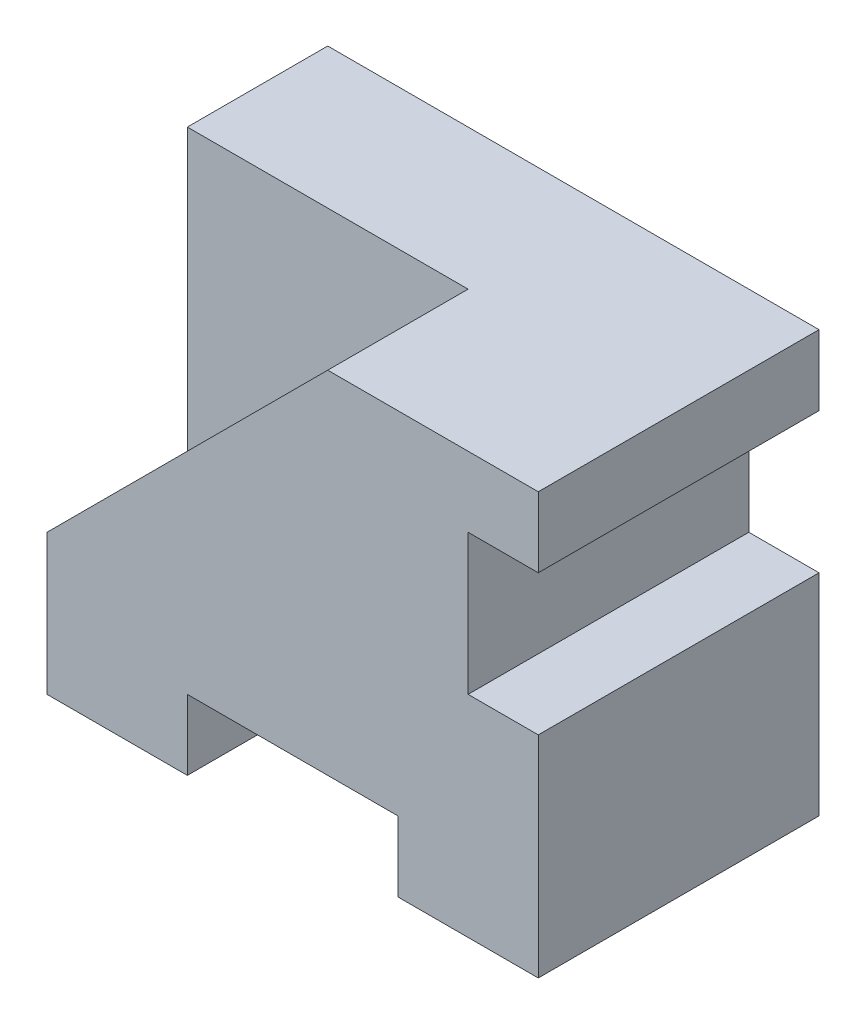
ISO-10303-21;
HEADER;
FILE_DESCRIPTION(('STEP AP214'),'2;1');
FILE_NAME('part.step','',(''),(''),'','','');
FILE_SCHEMA(('AUTOMOTIVE_DESIGN { 1 0 10303 214 1 1 1 1 }'));
ENDSEC;
DATA;
#1=APPLICATION_CONTEXT('core data for automotive mechanical design processes');
#2=APPLICATION_PROTOCOL_DEFINITION('international standard','automotive_design',2000,#1);
#3=PRODUCT_CONTEXT('',#1,'mechanical');
#4=PRODUCT('Part','Part','',(#3));
#5=PRODUCT_RELATED_PRODUCT_CATEGORY('part','',(#4));
#6=PRODUCT_DEFINITION_FORMATION('','',#4);
#7=PRODUCT_DEFINITION_CONTEXT('part definition',#1,'design');
#8=PRODUCT_DEFINITION('design','',#6,#7);
#9=PRODUCT_DEFINITION_SHAPE('','',#8);
#10=(LENGTH_UNIT() NAMED_UNIT(*) SI_UNIT(.MILLI.,.METRE.));
#11=(NAMED_UNIT(*) PLANE_ANGLE_UNIT() SI_UNIT($,.RADIAN.));
#12=(NAMED_UNIT(*) SI_UNIT($,.STERADIAN.) SOLID_ANGLE_UNIT());
#13=UNCERTAINTY_MEASURE_WITH_UNIT(LENGTH_MEASURE(1.E-05),#10,'distance_accuracy_value','');
#14=(GEOMETRIC_REPRESENTATION_CONTEXT(3) GLOBAL_UNCERTAINTY_ASSIGNED_CONTEXT((#13)) GLOBAL_UNIT_ASSIGNED_CONTEXT((#10,
#11,#12)) REPRESENTATION_CONTEXT('',''));
#15=CARTESIAN_POINT('',(0.,0.,0.));
#16=DIRECTION('',(0.,0.,1.));
#17=DIRECTION('',(1.,0.,0.));
#18=AXIS2_PLACEMENT_3D('',#15,#16,#17);
#19=CARTESIAN_POINT('',(0.,60.,0.));
#20=DIRECTION('',(0.,-1.,0.));
#21=DIRECTION('',(0.,0.,-1.));
#22=AXIS2_PLACEMENT_3D('',#19,#20,#21);
#23=PLANE('',#22);
#24=DIRECTION('',(0.,0.,-1.));
#25=VECTOR('',#24,1.);
#26=CARTESIAN_POINT('',(5.00000000000001,60.0000000000001,195.623445264011));
#27=LINE('',#26,#25);
#28=CARTESIAN_POINT('',(5.00000000000001,60.0000000000001,20.0000000000001));
#29=VERTEX_POINT('',#28);
#30=CARTESIAN_POINT('',(4.99999999999994,60.0000000000001,0.));
#31=VERTEX_POINT('',#30);
#32=EDGE_CURVE('E52',#29,#31,#27,.T.);
#33=ORIENTED_EDGE('',*,*,#32,.F.);
#34=DIRECTION('',(1.,0.,0.));
#35=VECTOR('',#34,1.);
#36=CARTESIAN_POINT('',(-35.,60.,20.));
#37=LINE('',#36,#35);
#38=CARTESIAN_POINT('',(35.,60.,20.));
#39=VERTEX_POINT('',#38);
#40=EDGE_CURVE('E155',#29,#39,#37,.T.);
#41=ORIENTED_EDGE('',*,*,#40,.T.);
#42=DIRECTION('',(0.,0.,-1.));
#43=VECTOR('',#42,1.);
#44=CARTESIAN_POINT('',(35.,60.,20.));
#45=LINE('',#44,#43);
#46=CARTESIAN_POINT('',(35.,60.,-20.));
#47=VERTEX_POINT('',#46);
#48=EDGE_CURVE('E172',#39,#47,#45,.T.);
#49=ORIENTED_EDGE('',*,*,#48,.T.);
#50=DIRECTION('',(-1.,0.,0.));
#51=VECTOR('',#50,1.);
#52=CARTESIAN_POINT('',(-35.,60.,-20.));
#53=LINE('',#52,#51);
#54=CARTESIAN_POINT('',(-35.,60.,-20.));
#55=VERTEX_POINT('',#54);
#56=EDGE_CURVE('E187',#47,#55,#53,.T.);
#57=ORIENTED_EDGE('',*,*,#56,.T.);
#58=DIRECTION('',(0.,0.,1.));
#59=VECTOR('',#58,1.);
#60=CARTESIAN_POINT('',(-35.,60.,20.));
#61=LINE('',#60,#59);
#62=CARTESIAN_POINT('',(-35.,60.,0.));
#63=VERTEX_POINT('',#62);
#64=EDGE_CURVE('E184',#55,#63,#61,.T.);
#65=ORIENTED_EDGE('',*,*,#64,.T.);
#66=DIRECTION('',(1.,0.,0.));
#67=VECTOR('',#66,1.);
#68=CARTESIAN_POINT('',(-35.,60.,0.));
#69=LINE('',#68,#67);
#70=EDGE_CURVE('E240',#63,#31,#69,.T.);
#71=ORIENTED_EDGE('',*,*,#70,.T.);
#72=EDGE_LOOP('',(#33,#41,#49,#57,#65,#71));
#73=FACE_BOUND('',#72,.T.);
#74=ADVANCED_FACE('F37',(#73),#23,.F.);
#75=CARTESIAN_POINT('',(35.,60.,20.));
#76=DIRECTION('',(-1.,0.,0.));
#77=DIRECTION('',(0.,0.,1.));
#78=AXIS2_PLACEMENT_3D('',#75,#76,#77);
#79=PLANE('',#78);
#80=DIRECTION('',(0.,-1.,0.));
#81=VECTOR('',#80,1.);
#82=CARTESIAN_POINT('',(35.,60.,-20.));
#83=LINE('',#82,#81);
#84=CARTESIAN_POINT('',(35.,30.,-20.));
#85=VERTEX_POINT('',#84);
#86=CARTESIAN_POINT('',(35.,0.,-20.));
#87=VERTEX_POINT('',#86);
#88=EDGE_CURVE('E45',#85,#87,#83,.T.);
#89=ORIENTED_EDGE('',*,*,#88,.F.);
#90=DIRECTION('',(0.,0.,1.));
#91=VECTOR('',#90,1.);
#92=CARTESIAN_POINT('',(35.,30.,-20.));
#93=LINE('',#92,#91);
#94=CARTESIAN_POINT('',(35.,30.,20.));
#95=VERTEX_POINT('',#94);
#96=EDGE_CURVE('E209',#85,#95,#93,.T.);
#97=ORIENTED_EDGE('',*,*,#96,.T.);
#98=DIRECTION('',(0.,-1.,0.));
#99=VECTOR('',#98,1.);
#100=CARTESIAN_POINT('',(35.,60.,20.));
#101=LINE('',#100,#99);
#102=CARTESIAN_POINT('',(35.,0.,20.));
#103=VERTEX_POINT('',#102);
#104=EDGE_CURVE('E167',#95,#103,#101,.T.);
#105=ORIENTED_EDGE('',*,*,#104,.T.);
#106=DIRECTION('',(0.,0.,-1.));
#107=VECTOR('',#106,1.);
#108=CARTESIAN_POINT('',(35.,0.,20.));
#109=LINE('',#108,#107);
#110=EDGE_CURVE('E179',#103,#87,#109,.T.);
#111=ORIENTED_EDGE('',*,*,#110,.T.);
#112=EDGE_LOOP('',(#89,#97,#105,#111));
#113=FACE_BOUND('',#112,.T.);
#114=ADVANCED_FACE('F274',(#113),#79,.F.);
#115=CARTESIAN_POINT('',(0.,0.,0.));
#116=DIRECTION('',(0.,-1.,0.));
#117=DIRECTION('',(0.,0.,-1.));
#118=AXIS2_PLACEMENT_3D('',#115,#116,#117);
#119=PLANE('',#118);
#120=DIRECTION('',(0.,0.,1.));
#121=VECTOR('',#120,1.);
#122=CARTESIAN_POINT('',(-15.,0.,-20.));
#123=LINE('',#122,#121);
#124=CARTESIAN_POINT('',(-15.,0.,-20.));
#125=VERTEX_POINT('',#124);
#126=CARTESIAN_POINT('',(-15.,0.,20.));
#127=VERTEX_POINT('',#126);
#128=EDGE_CURVE('E182',#125,#127,#123,.T.);
#129=ORIENTED_EDGE('',*,*,#128,.T.);
#130=DIRECTION('',(1.,0.,0.));
#131=VECTOR('',#130,1.);
#132=CARTESIAN_POINT('',(-35.,0.,20.));
#133=LINE('',#132,#131);
#134=CARTESIAN_POINT('',(-35.,0.,20.));
#135=VERTEX_POINT('',#134);
#136=EDGE_CURVE('E170',#135,#127,#133,.T.);
#137=ORIENTED_EDGE('',*,*,#136,.F.);
#138=DIRECTION('',(0.,0.,1.));
#139=VECTOR('',#138,1.);
#140=CARTESIAN_POINT('',(-35.,0.,20.));
#141=LINE('',#140,#139);
#142=CARTESIAN_POINT('',(-35.,0.,-20.));
#143=VERTEX_POINT('',#142);
#144=EDGE_CURVE('E161',#143,#135,#141,.T.);
#145=ORIENTED_EDGE('',*,*,#144,.F.);
#146=DIRECTION('',(-1.,0.,0.));
#147=VECTOR('',#146,1.);
#148=CARTESIAN_POINT('',(-35.,0.,-20.));
#149=LINE('',#148,#147);
#150=EDGE_CURVE('E178',#125,#143,#149,.T.);
#151=ORIENTED_EDGE('',*,*,#150,.F.);
#152=EDGE_LOOP('',(#129,#137,#145,#151));
#153=FACE_BOUND('',#152,.T.);
#154=ADVANCED_FACE('F252',(#153),#119,.T.);
#155=CARTESIAN_POINT('',(35.,50.,20.));
#156=VERTEX_POINT('',#155);
#157=EDGE_CURVE('E164',#39,#156,#101,.T.);
#158=ORIENTED_EDGE('',*,*,#157,.T.);
#159=DIRECTION('',(0.,0.,1.));
#160=VECTOR('',#159,1.);
#161=CARTESIAN_POINT('',(35.,50.,-20.));
#162=LINE('',#161,#160);
#163=CARTESIAN_POINT('',(35.,50.,-20.));
#164=VERTEX_POINT('',#163);
#165=EDGE_CURVE('E60',#164,#156,#162,.T.);
#166=ORIENTED_EDGE('',*,*,#165,.F.);
#167=EDGE_CURVE('E11',#47,#164,#83,.T.);
#168=ORIENTED_EDGE('',*,*,#167,.F.);
#169=ORIENTED_EDGE('',*,*,#48,.F.);
#170=EDGE_LOOP('',(#158,#166,#168,#169));
#171=FACE_BOUND('',#170,.T.);
#172=ADVANCED_FACE('F39',(#171),#79,.F.);
#173=CARTESIAN_POINT('',(-35.,60.,-20.));
#174=DIRECTION('',(0.,0.,1.));
#175=DIRECTION('',(1.,0.,0.));
#176=AXIS2_PLACEMENT_3D('',#173,#174,#175);
#177=PLANE('',#176);
#178=DIRECTION('',(0.,-1.,0.));
#179=VECTOR('',#178,1.);
#180=CARTESIAN_POINT('',(25.,50.,-20.));
#181=LINE('',#180,#179);
#182=CARTESIAN_POINT('',(25.,50.,-20.));
#183=VERTEX_POINT('',#182);
#184=CARTESIAN_POINT('',(25.,30.,-20.));
#185=VERTEX_POINT('',#184);
#186=EDGE_CURVE('E234',#183,#185,#181,.T.);
#187=ORIENTED_EDGE('',*,*,#186,.T.);
#188=DIRECTION('',(1.,0.,0.));
#189=VECTOR('',#188,1.);
#190=CARTESIAN_POINT('',(25.,30.,-20.));
#191=LINE('',#190,#189);
#192=EDGE_CURVE('E219',#185,#85,#191,.T.);
#193=ORIENTED_EDGE('',*,*,#192,.T.);
#194=ORIENTED_EDGE('',*,*,#88,.T.);
#195=CARTESIAN_POINT('',(15.,0.,-20.));
#196=VERTEX_POINT('',#195);
#197=EDGE_CURVE('E175',#87,#196,#149,.T.);
#198=ORIENTED_EDGE('',*,*,#197,.T.);
#199=DIRECTION('',(0.,1.,0.));
#200=VECTOR('',#199,1.);
#201=CARTESIAN_POINT('',(15.,10.,-20.));
#202=LINE('',#201,#200);
#203=CARTESIAN_POINT('',(15.,10.,-20.));
#204=VERTEX_POINT('',#203);
#205=EDGE_CURVE('E202',#196,#204,#202,.T.);
#206=ORIENTED_EDGE('',*,*,#205,.T.);
#207=DIRECTION('',(-1.,0.,0.));
#208=VECTOR('',#207,1.);
#209=CARTESIAN_POINT('',(-15.,10.,-20.));
#210=LINE('',#209,#208);
#211=CARTESIAN_POINT('',(-15.,10.,-20.));
#212=VERTEX_POINT('',#211);
#213=EDGE_CURVE('E212',#204,#212,#210,.T.);
#214=ORIENTED_EDGE('',*,*,#213,.T.);
#215=DIRECTION('',(0.,-1.,0.));
#216=VECTOR('',#215,1.);
#217=CARTESIAN_POINT('',(-15.,0.,-20.));
#218=LINE('',#217,#216);
#219=EDGE_CURVE('E194',#212,#125,#218,.T.);
#220=ORIENTED_EDGE('',*,*,#219,.T.);
#221=ORIENTED_EDGE('',*,*,#150,.T.);
#222=DIRECTION('',(0.,-1.,0.));
#223=VECTOR('',#222,1.);
#224=CARTESIAN_POINT('',(-35.,60.,-20.));
#225=LINE('',#224,#223);
#226=EDGE_CURVE('E163',#55,#143,#225,.T.);
#227=ORIENTED_EDGE('',*,*,#226,.F.);
#228=ORIENTED_EDGE('',*,*,#56,.F.);
#229=ORIENTED_EDGE('',*,*,#167,.T.);
#230=DIRECTION('',(-1.,0.,0.));
#231=VECTOR('',#230,1.);
#232=CARTESIAN_POINT('',(35.,50.,-20.));
#233=LINE('',#232,#231);
#234=EDGE_CURVE('E227',#164,#183,#233,.T.);
#235=ORIENTED_EDGE('',*,*,#234,.T.);
#236=EDGE_LOOP('',(#187,#193,#194,#198,#206,#214,#220,#221,#227,#228,#229,#235));
#237=FACE_BOUND('',#236,.T.);
#238=ADVANCED_FACE('F287',(#237),#177,.F.);
#239=CARTESIAN_POINT('',(-35.,60.,20.));
#240=DIRECTION('',(1.,0.,0.));
#241=DIRECTION('',(0.,0.,-1.));
#242=AXIS2_PLACEMENT_3D('',#239,#240,#241);
#243=PLANE('',#242);
#244=DIRECTION('',(0.,-1.,0.));
#245=VECTOR('',#244,1.);
#246=CARTESIAN_POINT('',(-35.,60.,20.));
#247=LINE('',#246,#245);
#248=CARTESIAN_POINT('',(-35.,20.,20.0000000000001));
#249=VERTEX_POINT('',#248);
#250=EDGE_CURVE('E152',#249,#135,#247,.T.);
#251=ORIENTED_EDGE('',*,*,#250,.F.);
#252=DIRECTION('',(0.,0.,-1.));
#253=VECTOR('',#252,1.);
#254=CARTESIAN_POINT('',(-35.,20.,195.623445264011));
#255=LINE('',#254,#253);
#256=CARTESIAN_POINT('',(-35.,20.,0.));
#257=VERTEX_POINT('',#256);
#258=EDGE_CURVE('E138',#249,#257,#255,.T.);
#259=ORIENTED_EDGE('',*,*,#258,.T.);
#260=DIRECTION('',(0.,-1.,0.));
#261=VECTOR('',#260,1.);
#262=CARTESIAN_POINT('',(-35.,60.,0.));
#263=LINE('',#262,#261);
#264=EDGE_CURVE('E156',#63,#257,#263,.T.);
#265=ORIENTED_EDGE('',*,*,#264,.F.);
#266=ORIENTED_EDGE('',*,*,#64,.F.);
#267=ORIENTED_EDGE('',*,*,#226,.T.);
#268=ORIENTED_EDGE('',*,*,#144,.T.);
#269=EDGE_LOOP('',(#251,#259,#265,#266,#267,#268));
#270=FACE_BOUND('',#269,.T.);
#271=ADVANCED_FACE('F158',(#270),#243,.F.);
#272=CARTESIAN_POINT('',(-35.,60.,20.));
#273=DIRECTION('',(0.,0.,-1.));
#274=DIRECTION('',(-1.,0.,0.));
#275=AXIS2_PLACEMENT_3D('',#272,#273,#274);
#276=PLANE('',#275);
#277=ORIENTED_EDGE('',*,*,#40,.F.);
#278=DIRECTION('',(-0.707106781186546,-0.707106781186549,0.));
#279=VECTOR('',#278,1.);
#280=CARTESIAN_POINT('',(-35.,20.,20.));
#281=LINE('',#280,#279);
#282=EDGE_CURVE('E141',#29,#249,#281,.T.);
#283=ORIENTED_EDGE('',*,*,#282,.T.);
#284=ORIENTED_EDGE('',*,*,#250,.T.);
#285=ORIENTED_EDGE('',*,*,#136,.T.);
#286=DIRECTION('',(0.,-1.,0.));
#287=VECTOR('',#286,1.);
#288=CARTESIAN_POINT('',(-15.,0.,20.));
#289=LINE('',#288,#287);
#290=CARTESIAN_POINT('',(-15.,10.,20.));
#291=VERTEX_POINT('',#290);
#292=EDGE_CURVE('E200',#291,#127,#289,.T.);
#293=ORIENTED_EDGE('',*,*,#292,.F.);
#294=DIRECTION('',(-1.,0.,0.));
#295=VECTOR('',#294,1.);
#296=CARTESIAN_POINT('',(-15.,10.,20.));
#297=LINE('',#296,#295);
#298=CARTESIAN_POINT('',(15.,10.,20.));
#299=VERTEX_POINT('',#298);
#300=EDGE_CURVE('E203',#299,#291,#297,.T.);
#301=ORIENTED_EDGE('',*,*,#300,.F.);
#302=DIRECTION('',(0.,1.,0.));
#303=VECTOR('',#302,1.);
#304=CARTESIAN_POINT('',(15.,10.,20.));
#305=LINE('',#304,#303);
#306=CARTESIAN_POINT('',(15.,0.,20.));
#307=VERTEX_POINT('',#306);
#308=EDGE_CURVE('E206',#307,#299,#305,.T.);
#309=ORIENTED_EDGE('',*,*,#308,.F.);
#310=EDGE_CURVE('E173',#307,#103,#133,.T.);
#311=ORIENTED_EDGE('',*,*,#310,.T.);
#312=ORIENTED_EDGE('',*,*,#104,.F.);
#313=DIRECTION('',(1.,0.,0.));
#314=VECTOR('',#313,1.);
#315=CARTESIAN_POINT('',(25.,30.,20.));
#316=LINE('',#315,#314);
#317=CARTESIAN_POINT('',(25.,30.,20.));
#318=VERTEX_POINT('',#317);
#319=EDGE_CURVE('E225',#318,#95,#316,.T.);
#320=ORIENTED_EDGE('',*,*,#319,.F.);
#321=DIRECTION('',(0.,-1.,0.));
#322=VECTOR('',#321,1.);
#323=CARTESIAN_POINT('',(25.,50.,20.));
#324=LINE('',#323,#322);
#325=CARTESIAN_POINT('',(25.,50.,20.));
#326=VERTEX_POINT('',#325);
#327=EDGE_CURVE('E228',#326,#318,#324,.T.);
#328=ORIENTED_EDGE('',*,*,#327,.F.);
#329=DIRECTION('',(-1.,0.,0.));
#330=VECTOR('',#329,1.);
#331=CARTESIAN_POINT('',(35.,50.,20.));
#332=LINE('',#331,#330);
#333=EDGE_CURVE('E146',#156,#326,#332,.T.);
#334=ORIENTED_EDGE('',*,*,#333,.F.);
#335=ORIENTED_EDGE('',*,*,#157,.F.);
#336=EDGE_LOOP('',(#277,#283,#284,#285,#293,#301,#309,#311,#312,#320,#328,#334,#335));
#337=FACE_BOUND('',#336,.T.);
#338=ADVANCED_FACE('F150',(#337),#276,.F.);
#339=DIRECTION('',(0.,0.,1.));
#340=VECTOR('',#339,1.);
#341=CARTESIAN_POINT('',(15.,0.,-20.));
#342=LINE('',#341,#340);
#343=EDGE_CURVE('E191',#196,#307,#342,.T.);
#344=ORIENTED_EDGE('',*,*,#343,.F.);
#345=ORIENTED_EDGE('',*,*,#197,.F.);
#346=ORIENTED_EDGE('',*,*,#110,.F.);
#347=ORIENTED_EDGE('',*,*,#310,.F.);
#348=EDGE_LOOP('',(#344,#345,#346,#347));
#349=FACE_BOUND('',#348,.T.);
#350=ADVANCED_FACE('F270',(#349),#119,.T.);
#351=CARTESIAN_POINT('',(-15.,0.,-20.));
#352=DIRECTION('',(-1.,0.,0.));
#353=DIRECTION('',(0.,-1.,0.));
#354=AXIS2_PLACEMENT_3D('',#351,#352,#353);
#355=PLANE('',#354);
#356=ORIENTED_EDGE('',*,*,#292,.T.);
#357=ORIENTED_EDGE('',*,*,#128,.F.);
#358=ORIENTED_EDGE('',*,*,#219,.F.);
#359=DIRECTION('',(0.,0.,1.));
#360=VECTOR('',#359,1.);
#361=CARTESIAN_POINT('',(-15.,10.,-20.));
#362=LINE('',#361,#360);
#363=EDGE_CURVE('E196',#212,#291,#362,.T.);
#364=ORIENTED_EDGE('',*,*,#363,.T.);
#365=EDGE_LOOP('',(#356,#357,#358,#364));
#366=FACE_BOUND('',#365,.T.);
#367=ADVANCED_FACE('F257',(#366),#355,.F.);
#368=CARTESIAN_POINT('',(-15.,10.,-20.));
#369=DIRECTION('',(0.,1.,0.));
#370=DIRECTION('',(-1.,0.,0.));
#371=AXIS2_PLACEMENT_3D('',#368,#369,#370);
#372=PLANE('',#371);
#373=ORIENTED_EDGE('',*,*,#300,.T.);
#374=ORIENTED_EDGE('',*,*,#363,.F.);
#375=ORIENTED_EDGE('',*,*,#213,.F.);
#376=DIRECTION('',(0.,0.,1.));
#377=VECTOR('',#376,1.);
#378=CARTESIAN_POINT('',(15.,10.,-20.));
#379=LINE('',#378,#377);
#380=EDGE_CURVE('E193',#204,#299,#379,.T.);
#381=ORIENTED_EDGE('',*,*,#380,.T.);
#382=EDGE_LOOP('',(#373,#374,#375,#381));
#383=FACE_BOUND('',#382,.T.);
#384=ADVANCED_FACE('F261',(#383),#372,.F.);
#385=CARTESIAN_POINT('',(15.,10.,-20.));
#386=DIRECTION('',(1.,0.,0.));
#387=DIRECTION('',(0.,1.,0.));
#388=AXIS2_PLACEMENT_3D('',#385,#386,#387);
#389=PLANE('',#388);
#390=ORIENTED_EDGE('',*,*,#308,.T.);
#391=ORIENTED_EDGE('',*,*,#380,.F.);
#392=ORIENTED_EDGE('',*,*,#205,.F.);
#393=ORIENTED_EDGE('',*,*,#343,.T.);
#394=EDGE_LOOP('',(#390,#391,#392,#393));
#395=FACE_BOUND('',#394,.T.);
#396=ADVANCED_FACE('F263',(#395),#389,.F.);
#397=CARTESIAN_POINT('',(25.,30.,-20.));
#398=DIRECTION('',(0.,-1.,0.));
#399=DIRECTION('',(0.,0.,-1.));
#400=AXIS2_PLACEMENT_3D('',#397,#398,#399);
#401=PLANE('',#400);
#402=ORIENTED_EDGE('',*,*,#319,.T.);
#403=ORIENTED_EDGE('',*,*,#96,.F.);
#404=ORIENTED_EDGE('',*,*,#192,.F.);
#405=DIRECTION('',(0.,0.,1.));
#406=VECTOR('',#405,1.);
#407=CARTESIAN_POINT('',(25.,30.,-20.));
#408=LINE('',#407,#406);
#409=EDGE_CURVE('E221',#185,#318,#408,.T.);
#410=ORIENTED_EDGE('',*,*,#409,.T.);
#411=EDGE_LOOP('',(#402,#403,#404,#410));
#412=FACE_BOUND('',#411,.T.);
#413=ADVANCED_FACE('F278',(#412),#401,.F.);
#414=CARTESIAN_POINT('',(25.,50.,-20.));
#415=DIRECTION('',(-1.,0.,0.));
#416=DIRECTION('',(0.,-1.,0.));
#417=AXIS2_PLACEMENT_3D('',#414,#415,#416);
#418=PLANE('',#417);
#419=ORIENTED_EDGE('',*,*,#327,.T.);
#420=ORIENTED_EDGE('',*,*,#409,.F.);
#421=ORIENTED_EDGE('',*,*,#186,.F.);
#422=DIRECTION('',(0.,0.,1.));
#423=VECTOR('',#422,1.);
#424=CARTESIAN_POINT('',(25.,50.,-20.));
#425=LINE('',#424,#423);
#426=EDGE_CURVE('E218',#183,#326,#425,.T.);
#427=ORIENTED_EDGE('',*,*,#426,.T.);
#428=EDGE_LOOP('',(#419,#420,#421,#427));
#429=FACE_BOUND('',#428,.T.);
#430=ADVANCED_FACE('F282',(#429),#418,.F.);
#431=CARTESIAN_POINT('',(35.,50.,-20.));
#432=DIRECTION('',(0.,1.,0.));
#433=DIRECTION('',(0.,0.,1.));
#434=AXIS2_PLACEMENT_3D('',#431,#432,#433);
#435=PLANE('',#434);
#436=ORIENTED_EDGE('',*,*,#333,.T.);
#437=ORIENTED_EDGE('',*,*,#426,.F.);
#438=ORIENTED_EDGE('',*,*,#234,.F.);
#439=ORIENTED_EDGE('',*,*,#165,.T.);
#440=EDGE_LOOP('',(#436,#437,#438,#439));
#441=FACE_BOUND('',#440,.T.);
#442=ADVANCED_FACE('F283',(#441),#435,.F.);
#443=CARTESIAN_POINT('',(-35.,20.,195.623445264011));
#444=DIRECTION('',(-0.707106781186549,0.707106781186546,0.));
#445=DIRECTION('',(-0.707106781186546,-0.707106781186549,0.));
#446=AXIS2_PLACEMENT_3D('',#443,#444,#445);
#447=PLANE('',#446);
#448=ORIENTED_EDGE('',*,*,#282,.F.);
#449=ORIENTED_EDGE('',*,*,#32,.T.);
#450=DIRECTION('',(-0.707106781186546,-0.707106781186549,0.));
#451=VECTOR('',#450,1.);
#452=CARTESIAN_POINT('',(-35.,20.,0.));
#453=LINE('',#452,#451);
#454=EDGE_CURVE('E142',#31,#257,#453,.T.);
#455=ORIENTED_EDGE('',*,*,#454,.T.);
#456=ORIENTED_EDGE('',*,*,#258,.F.);
#457=EDGE_LOOP('',(#448,#449,#455,#456));
#458=FACE_BOUND('',#457,.T.);
#459=ADVANCED_FACE('F140',(#458),#447,.T.);
#460=CARTESIAN_POINT('',(-35.,60.,0.));
#461=DIRECTION('',(0.,0.,-1.));
#462=DIRECTION('',(-1.,0.,0.));
#463=AXIS2_PLACEMENT_3D('',#460,#461,#462);
#464=PLANE('',#463);
#465=ORIENTED_EDGE('',*,*,#264,.T.);
#466=ORIENTED_EDGE('',*,*,#454,.F.);
#467=ORIENTED_EDGE('',*,*,#70,.F.);
#468=EDGE_LOOP('',(#465,#466,#467));
#469=FACE_BOUND('',#468,.T.);
#470=ADVANCED_FACE('F247',(#469),#464,.F.);
#471=CLOSED_SHELL('',(#74,#114,#154,#172,#238,#271,#338,#350,#367,#384,#396,#413,#430,#442,#459,#470));
#472=MANIFOLD_SOLID_BREP('B2',#471);
#473=ADVANCED_BREP_SHAPE_REPRESENTATION('',(#18,#472),#14);
#474=SHAPE_DEFINITION_REPRESENTATION(#9,#473);
ENDSEC;
END-ISO-10303-21;
